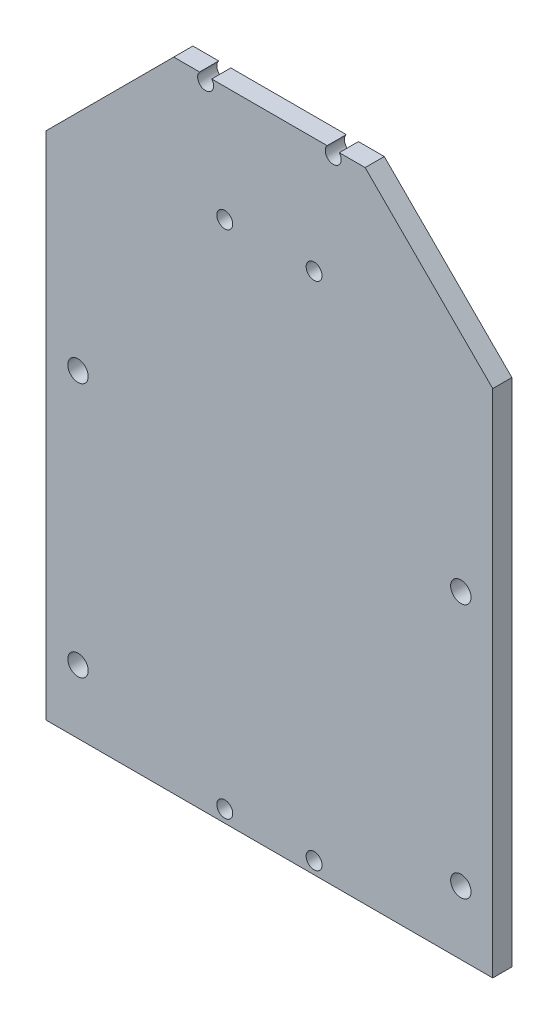
ISO-10303-21;
HEADER;
FILE_DESCRIPTION(('STEP AP214'),'2;1');
FILE_NAME('part.step','',(''),(''),'','','');
FILE_SCHEMA(('AUTOMOTIVE_DESIGN { 1 0 10303 214 1 1 1 1 }'));
ENDSEC;
DATA;
#1=APPLICATION_CONTEXT('core data for automotive mechanical design processes');
#2=APPLICATION_PROTOCOL_DEFINITION('international standard','automotive_design',2000,#1);
#3=PRODUCT_CONTEXT('',#1,'mechanical');
#4=PRODUCT('Part','Part','',(#3));
#5=PRODUCT_RELATED_PRODUCT_CATEGORY('part','',(#4));
#6=PRODUCT_DEFINITION_FORMATION('','',#4);
#7=PRODUCT_DEFINITION_CONTEXT('part definition',#1,'design');
#8=PRODUCT_DEFINITION('design','',#6,#7);
#9=PRODUCT_DEFINITION_SHAPE('','',#8);
#10=(LENGTH_UNIT() NAMED_UNIT(*) SI_UNIT(.MILLI.,.METRE.));
#11=(NAMED_UNIT(*) PLANE_ANGLE_UNIT() SI_UNIT($,.RADIAN.));
#12=(NAMED_UNIT(*) SI_UNIT($,.STERADIAN.) SOLID_ANGLE_UNIT());
#13=UNCERTAINTY_MEASURE_WITH_UNIT(LENGTH_MEASURE(1.E-05),#10,'distance_accuracy_value','');
#14=(GEOMETRIC_REPRESENTATION_CONTEXT(3) GLOBAL_UNCERTAINTY_ASSIGNED_CONTEXT((#13)) GLOBAL_UNIT_ASSIGNED_CONTEXT((#10,
#11,#12)) REPRESENTATION_CONTEXT('',''));
#15=CARTESIAN_POINT('',(0.,0.,0.));
#16=DIRECTION('',(0.,0.,1.));
#17=DIRECTION('',(1.,0.,0.));
#18=AXIS2_PLACEMENT_3D('',#15,#16,#17);
#19=CARTESIAN_POINT('',(-79.2332323241201,122.350653578044,3.));
#20=DIRECTION('',(0.,-1.,0.));
#21=DIRECTION('',(0.,0.,-1.));
#22=AXIS2_PLACEMENT_3D('',#19,#20,#21);
#23=PLANE('',#22);
#24=DIRECTION('',(-1.,0.,0.));
#25=VECTOR('',#24,1.);
#26=CARTESIAN_POINT('',(-79.2332323241201,122.350653578044,0.));
#27=LINE('',#26,#25);
#28=CARTESIAN_POINT('',(-55.1815029847395,122.350653578044,0.));
#29=VERTEX_POINT('',#28);
#30=CARTESIAN_POINT('',(-59.23323232412,122.350653578044,0.));
#31=VERTEX_POINT('',#30);
#32=EDGE_CURVE('E151',#29,#31,#27,.T.);
#33=ORIENTED_EDGE('',*,*,#32,.T.);
#34=DIRECTION('',(0.,0.,1.));
#35=VECTOR('',#34,1.);
#36=CARTESIAN_POINT('',(-59.23323232412,122.350653578044,3.));
#37=LINE('',#36,#35);
#38=CARTESIAN_POINT('',(-59.23323232412,122.350653578044,3.));
#39=VERTEX_POINT('',#38);
#40=EDGE_CURVE('E171',#31,#39,#37,.T.);
#41=ORIENTED_EDGE('',*,*,#40,.T.);
#42=DIRECTION('',(-1.,0.,0.));
#43=VECTOR('',#42,1.);
#44=CARTESIAN_POINT('',(-79.2332323241201,122.350653578044,3.));
#45=LINE('',#44,#43);
#46=CARTESIAN_POINT('',(-55.1815029847395,122.350653578044,3.));
#47=VERTEX_POINT('',#46);
#48=EDGE_CURVE('E137',#47,#39,#45,.T.);
#49=ORIENTED_EDGE('',*,*,#48,.F.);
#50=DIRECTION('',(0.,0.,-1.));
#51=VECTOR('',#50,1.);
#52=CARTESIAN_POINT('',(-55.1815029847395,122.350653578044,3.));
#53=LINE('',#52,#51);
#54=EDGE_CURVE('E193',#47,#29,#53,.T.);
#55=ORIENTED_EDGE('',*,*,#54,.T.);
#56=EDGE_LOOP('',(#33,#41,#49,#55));
#57=FACE_BOUND('',#56,.T.);
#58=ADVANCED_FACE('F34',(#57),#23,.F.);
#59=CARTESIAN_POINT('',(-35.1815029847394,122.350653578044,0.));
#60=VERTEX_POINT('',#59);
#61=CARTESIAN_POINT('',(-53.2849616634968,122.350653578044,0.));
#62=VERTEX_POINT('',#61);
#63=EDGE_CURVE('E155',#60,#62,#27,.T.);
#64=ORIENTED_EDGE('',*,*,#63,.T.);
#65=DIRECTION('',(0.,0.,-1.));
#66=VECTOR('',#65,1.);
#67=CARTESIAN_POINT('',(-53.2849616634968,122.350653578044,3.));
#68=LINE('',#67,#66);
#69=CARTESIAN_POINT('',(-53.2849616634968,122.350653578044,3.));
#70=VERTEX_POINT('',#69);
#71=EDGE_CURVE('E123',#62,#70,#68,.F.);
#72=ORIENTED_EDGE('',*,*,#71,.T.);
#73=CARTESIAN_POINT('',(-35.1815029847394,122.350653578044,3.));
#74=VERTEX_POINT('',#73);
#75=EDGE_CURVE('E130',#74,#70,#45,.T.);
#76=ORIENTED_EDGE('',*,*,#75,.F.);
#77=DIRECTION('',(0.,0.,-1.));
#78=VECTOR('',#77,1.);
#79=CARTESIAN_POINT('',(-35.1815029847394,122.350653578044,3.));
#80=LINE('',#79,#78);
#81=EDGE_CURVE('E111',#74,#60,#80,.T.);
#82=ORIENTED_EDGE('',*,*,#81,.T.);
#83=EDGE_LOOP('',(#64,#72,#76,#82));
#84=FACE_BOUND('',#83,.T.);
#85=ADVANCED_FACE('F136',(#84),#23,.F.);
#86=CARTESIAN_POINT('',(-79.2332323241201,22.3506535780441,3.));
#87=DIRECTION('',(1.,0.,0.));
#88=DIRECTION('',(0.,0.,-1.));
#89=AXIS2_PLACEMENT_3D('',#86,#87,#88);
#90=PLANE('',#89);
#91=DIRECTION('',(0.,-1.,0.));
#92=VECTOR('',#91,1.);
#93=CARTESIAN_POINT('',(-79.2332323241201,22.3506535780441,3.));
#94=LINE('',#93,#92);
#95=CARTESIAN_POINT('',(-79.2332323241201,102.350653578044,3.));
#96=VERTEX_POINT('',#95);
#97=CARTESIAN_POINT('',(-79.2332323241201,22.3506535780441,3.));
#98=VERTEX_POINT('',#97);
#99=EDGE_CURVE('E154',#96,#98,#94,.T.);
#100=ORIENTED_EDGE('',*,*,#99,.F.);
#101=DIRECTION('',(0.,0.,-1.));
#102=VECTOR('',#101,1.);
#103=CARTESIAN_POINT('',(-79.2332323241201,102.350653578044,3.));
#104=LINE('',#103,#102);
#105=CARTESIAN_POINT('',(-79.2332323241201,102.350653578044,0.));
#106=VERTEX_POINT('',#105);
#107=EDGE_CURVE('E164',#96,#106,#104,.T.);
#108=ORIENTED_EDGE('',*,*,#107,.T.);
#109=DIRECTION('',(0.,-1.,0.));
#110=VECTOR('',#109,1.);
#111=CARTESIAN_POINT('',(-79.2332323241201,22.3506535780441,0.));
#112=LINE('',#111,#110);
#113=CARTESIAN_POINT('',(-79.2332323241201,22.3506535780441,0.));
#114=VERTEX_POINT('',#113);
#115=EDGE_CURVE('E144',#106,#114,#112,.T.);
#116=ORIENTED_EDGE('',*,*,#115,.T.);
#117=DIRECTION('',(0.,0.,-1.));
#118=VECTOR('',#117,1.);
#119=CARTESIAN_POINT('',(-79.2332323241201,22.3506535780441,3.));
#120=LINE('',#119,#118);
#121=EDGE_CURVE('E158',#98,#114,#120,.T.);
#122=ORIENTED_EDGE('',*,*,#121,.F.);
#123=EDGE_LOOP('',(#100,#108,#116,#122));
#124=FACE_BOUND('',#123,.T.);
#125=ADVANCED_FACE('F202',(#124),#90,.F.);
#126=CARTESIAN_POINT('',(-79.2332323241201,22.3506535780441,3.));
#127=DIRECTION('',(0.,1.,0.));
#128=DIRECTION('',(0.,0.,1.));
#129=AXIS2_PLACEMENT_3D('',#126,#127,#128);
#130=PLANE('',#129);
#131=DIRECTION('',(1.,0.,0.));
#132=VECTOR('',#131,1.);
#133=CARTESIAN_POINT('',(-79.2332323241201,22.3506535780441,0.));
#134=LINE('',#133,#132);
#135=CARTESIAN_POINT('',(-9.23323232412008,22.3506535780441,0.));
#136=VERTEX_POINT('',#135);
#137=EDGE_CURVE('E146',#114,#136,#134,.T.);
#138=ORIENTED_EDGE('',*,*,#137,.T.);
#139=DIRECTION('',(0.,0.,-1.));
#140=VECTOR('',#139,1.);
#141=CARTESIAN_POINT('',(-9.23323232412008,22.3506535780441,3.));
#142=LINE('',#141,#140);
#143=CARTESIAN_POINT('',(-9.23323232412008,22.3506535780441,3.));
#144=VERTEX_POINT('',#143);
#145=EDGE_CURVE('E139',#144,#136,#142,.T.);
#146=ORIENTED_EDGE('',*,*,#145,.F.);
#147=DIRECTION('',(1.,0.,0.));
#148=VECTOR('',#147,1.);
#149=CARTESIAN_POINT('',(-79.2332323241201,22.3506535780441,3.));
#150=LINE('',#149,#148);
#151=EDGE_CURVE('E203',#98,#144,#150,.T.);
#152=ORIENTED_EDGE('',*,*,#151,.F.);
#153=ORIENTED_EDGE('',*,*,#121,.T.);
#154=EDGE_LOOP('',(#138,#146,#152,#153));
#155=FACE_BOUND('',#154,.T.);
#156=ADVANCED_FACE('F302',(#155),#130,.F.);
#157=CARTESIAN_POINT('',(-9.23323232412008,22.3506535780441,3.));
#158=DIRECTION('',(-1.,0.,0.));
#159=DIRECTION('',(0.,-1.,0.));
#160=AXIS2_PLACEMENT_3D('',#157,#158,#159);
#161=PLANE('',#160);
#162=DIRECTION('',(0.,1.,0.));
#163=VECTOR('',#162,1.);
#164=CARTESIAN_POINT('',(-9.23323232412008,22.3506535780441,0.));
#165=LINE('',#164,#163);
#166=CARTESIAN_POINT('',(-9.23323232412008,102.350653578044,0.));
#167=VERTEX_POINT('',#166);
#168=EDGE_CURVE('E149',#136,#167,#165,.T.);
#169=ORIENTED_EDGE('',*,*,#168,.T.);
#170=DIRECTION('',(0.,0.,1.));
#171=VECTOR('',#170,1.);
#172=CARTESIAN_POINT('',(-9.23323232412008,102.350653578044,3.));
#173=LINE('',#172,#171);
#174=CARTESIAN_POINT('',(-9.23323232412008,102.350653578044,3.));
#175=VERTEX_POINT('',#174);
#176=EDGE_CURVE('E11',#167,#175,#173,.T.);
#177=ORIENTED_EDGE('',*,*,#176,.T.);
#178=DIRECTION('',(0.,1.,0.));
#179=VECTOR('',#178,1.);
#180=CARTESIAN_POINT('',(-9.23323232412008,22.3506535780441,3.));
#181=LINE('',#180,#179);
#182=EDGE_CURVE('E140',#144,#175,#181,.T.);
#183=ORIENTED_EDGE('',*,*,#182,.F.);
#184=ORIENTED_EDGE('',*,*,#145,.T.);
#185=EDGE_LOOP('',(#169,#177,#183,#184));
#186=FACE_BOUND('',#185,.T.);
#187=ADVANCED_FACE('F292',(#186),#161,.F.);
#188=CARTESIAN_POINT('',(-29.2332323241201,122.350653578044,3.));
#189=VERTEX_POINT('',#188);
#190=CARTESIAN_POINT('',(-33.2849616634968,122.350653578044,3.));
#191=VERTEX_POINT('',#190);
#192=EDGE_CURVE('E131',#189,#191,#45,.T.);
#193=ORIENTED_EDGE('',*,*,#192,.F.);
#194=DIRECTION('',(0.,0.,-1.));
#195=VECTOR('',#194,1.);
#196=CARTESIAN_POINT('',(-29.2332323241201,122.350653578044,3.));
#197=LINE('',#196,#195);
#198=CARTESIAN_POINT('',(-29.2332323241201,122.350653578044,0.));
#199=VERTEX_POINT('',#198);
#200=EDGE_CURVE('E42',#189,#199,#197,.T.);
#201=ORIENTED_EDGE('',*,*,#200,.T.);
#202=CARTESIAN_POINT('',(-33.2849616634968,122.350653578044,0.));
#203=VERTEX_POINT('',#202);
#204=EDGE_CURVE('E152',#199,#203,#27,.T.);
#205=ORIENTED_EDGE('',*,*,#204,.T.);
#206=DIRECTION('',(0.,0.,-1.));
#207=VECTOR('',#206,1.);
#208=CARTESIAN_POINT('',(-33.2849616634968,122.350653578044,3.));
#209=LINE('',#208,#207);
#210=EDGE_CURVE('E124',#203,#191,#209,.F.);
#211=ORIENTED_EDGE('',*,*,#210,.T.);
#212=EDGE_LOOP('',(#193,#201,#205,#211));
#213=FACE_BOUND('',#212,.T.);
#214=ADVANCED_FACE('F179',(#213),#23,.F.);
#215=CARTESIAN_POINT('',(0.,0.,3.));
#216=DIRECTION('',(0.,0.,-1.));
#217=DIRECTION('',(-1.,0.,0.));
#218=AXIS2_PLACEMENT_3D('',#215,#216,#217);
#219=PLANE('',#218);
#220=CARTESIAN_POINT('',(-51.2330663241181,104.2862198488,3.));
#221=DIRECTION('',(0.,0.,-1.));
#222=DIRECTION('',(-1.,0.,0.));
#223=AXIS2_PLACEMENT_3D('',#220,#221,#222);
#224=CIRCLE('',#223,1.25);
#225=CARTESIAN_POINT('',(-52.4830663241181,104.2862198488,3.));
#226=VERTEX_POINT('',#225);
#227=EDGE_CURVE('E236',#226,#226,#224,.T.);
#228=ORIENTED_EDGE('',*,*,#227,.T.);
#229=EDGE_LOOP('',(#228));
#230=FACE_BOUND('',#229,.T.);
#231=CARTESIAN_POINT('',(-37.2330663241181,24.2862198488002,3.));
#232=DIRECTION('',(0.,0.,-1.));
#233=DIRECTION('',(-1.,0.,0.));
#234=AXIS2_PLACEMENT_3D('',#231,#232,#233);
#235=CIRCLE('',#234,1.25);
#236=CARTESIAN_POINT('',(-38.4830663241181,24.2862198488002,3.));
#237=VERTEX_POINT('',#236);
#238=EDGE_CURVE('E243',#237,#237,#235,.T.);
#239=ORIENTED_EDGE('',*,*,#238,.T.);
#240=EDGE_LOOP('',(#239));
#241=FACE_BOUND('',#240,.T.);
#242=CARTESIAN_POINT('',(-51.2330663241181,24.2862198488002,3.));
#243=DIRECTION('',(0.,0.,-1.));
#244=DIRECTION('',(-1.,0.,0.));
#245=AXIS2_PLACEMENT_3D('',#242,#243,#244);
#246=CIRCLE('',#245,1.25);
#247=CARTESIAN_POINT('',(-52.4830663241181,24.2862198488002,3.));
#248=VERTEX_POINT('',#247);
#249=EDGE_CURVE('E244',#248,#248,#246,.T.);
#250=ORIENTED_EDGE('',*,*,#249,.T.);
#251=EDGE_LOOP('',(#250));
#252=FACE_BOUND('',#251,.T.);
#253=CARTESIAN_POINT('',(-37.2330663241181,104.2862198488,3.));
#254=DIRECTION('',(0.,0.,-1.));
#255=DIRECTION('',(-1.,0.,0.));
#256=AXIS2_PLACEMENT_3D('',#253,#254,#255);
#257=CIRCLE('',#256,1.25);
#258=CARTESIAN_POINT('',(-38.4830663241181,104.2862198488,3.));
#259=VERTEX_POINT('',#258);
#260=EDGE_CURVE('E232',#259,#259,#257,.T.);
#261=ORIENTED_EDGE('',*,*,#260,.T.);
#262=EDGE_LOOP('',(#261));
#263=FACE_BOUND('',#262,.T.);
#264=CARTESIAN_POINT('',(-74.2332323241201,72.2862198488002,3.));
#265=DIRECTION('',(0.,0.,1.));
#266=DIRECTION('',(1.,0.,0.));
#267=AXIS2_PLACEMENT_3D('',#264,#265,#266);
#268=CIRCLE('',#267,1.60000000000001);
#269=CARTESIAN_POINT('',(-72.6332323241201,72.2862198488002,3.));
#270=VERTEX_POINT('',#269);
#271=EDGE_CURVE('E212',#270,#270,#268,.T.);
#272=ORIENTED_EDGE('',*,*,#271,.F.);
#273=EDGE_LOOP('',(#272));
#274=FACE_BOUND('',#273,.T.);
#275=CARTESIAN_POINT('',(-14.2332323241201,72.2862198488002,3.));
#276=DIRECTION('',(0.,0.,1.));
#277=DIRECTION('',(1.,0.,0.));
#278=AXIS2_PLACEMENT_3D('',#275,#276,#277);
#279=CIRCLE('',#278,1.60000000000001);
#280=CARTESIAN_POINT('',(-12.6332323241201,72.2862198488002,3.));
#281=VERTEX_POINT('',#280);
#282=EDGE_CURVE('E218',#281,#281,#279,.T.);
#283=ORIENTED_EDGE('',*,*,#282,.F.);
#284=EDGE_LOOP('',(#283));
#285=FACE_BOUND('',#284,.T.);
#286=CARTESIAN_POINT('',(-14.2332323241201,32.3506535780441,3.));
#287=DIRECTION('',(0.,0.,1.));
#288=DIRECTION('',(1.,0.,0.));
#289=AXIS2_PLACEMENT_3D('',#286,#287,#288);
#290=CIRCLE('',#289,1.6);
#291=CARTESIAN_POINT('',(-12.6332323241201,32.3506535780441,3.));
#292=VERTEX_POINT('',#291);
#293=EDGE_CURVE('E224',#292,#292,#290,.T.);
#294=ORIENTED_EDGE('',*,*,#293,.F.);
#295=EDGE_LOOP('',(#294));
#296=FACE_BOUND('',#295,.T.);
#297=CARTESIAN_POINT('',(-74.2332323241201,32.3506535780441,3.));
#298=DIRECTION('',(0.,0.,1.));
#299=DIRECTION('',(1.,0.,0.));
#300=AXIS2_PLACEMENT_3D('',#297,#298,#299);
#301=CIRCLE('',#300,1.6);
#302=CARTESIAN_POINT('',(-72.6332323241201,32.3506535780441,3.));
#303=VERTEX_POINT('',#302);
#304=EDGE_CURVE('E206',#303,#303,#301,.T.);
#305=ORIENTED_EDGE('',*,*,#304,.F.);
#306=EDGE_LOOP('',(#305));
#307=FACE_BOUND('',#306,.T.);
#308=ORIENTED_EDGE('',*,*,#48,.T.);
#309=DIRECTION('',(0.707106781186549,0.707106781186546,0.));
#310=VECTOR('',#309,1.);
#311=CARTESIAN_POINT('',(-79.2332323241201,102.350653578044,3.));
#312=LINE('',#311,#310);
#313=EDGE_CURVE('E174',#39,#96,#312,.F.);
#314=ORIENTED_EDGE('',*,*,#313,.T.);
#315=ORIENTED_EDGE('',*,*,#99,.T.);
#316=ORIENTED_EDGE('',*,*,#151,.T.);
#317=ORIENTED_EDGE('',*,*,#182,.T.);
#318=DIRECTION('',(0.707106781186546,-0.707106781186549,0.));
#319=VECTOR('',#318,1.);
#320=CARTESIAN_POINT('',(-29.2332323241201,122.350653578044,3.));
#321=LINE('',#320,#319);
#322=EDGE_CURVE('E49',#175,#189,#321,.F.);
#323=ORIENTED_EDGE('',*,*,#322,.T.);
#324=ORIENTED_EDGE('',*,*,#192,.T.);
#325=CARTESIAN_POINT('',(-34.2332323241181,121.5362318481,3.));
#326=DIRECTION('',(0.,0.,-1.));
#327=DIRECTION('',(-1.,0.,0.));
#328=AXIS2_PLACEMENT_3D('',#325,#326,#327);
#329=CIRCLE('',#328,1.25);
#330=EDGE_CURVE('E115',#191,#74,#329,.T.);
#331=ORIENTED_EDGE('',*,*,#330,.T.);
#332=ORIENTED_EDGE('',*,*,#75,.T.);
#333=CARTESIAN_POINT('',(-54.2332323241181,121.5362318481,3.));
#334=DIRECTION('',(0.,0.,-1.));
#335=DIRECTION('',(-1.,0.,0.));
#336=AXIS2_PLACEMENT_3D('',#333,#334,#335);
#337=CIRCLE('',#336,1.25);
#338=EDGE_CURVE('E133',#70,#47,#337,.T.);
#339=ORIENTED_EDGE('',*,*,#338,.T.);
#340=EDGE_LOOP('',(#308,#314,#315,#316,#317,#323,#324,#331,#332,#339));
#341=FACE_BOUND('',#340,.T.);
#342=ADVANCED_FACE('F128',(#230,#241,#252,#263,#274,#285,#296,#307,#341),#219,.F.);
#343=CARTESIAN_POINT('',(0.,0.,0.));
#344=DIRECTION('',(0.,0.,-1.));
#345=DIRECTION('',(-1.,0.,0.));
#346=AXIS2_PLACEMENT_3D('',#343,#344,#345);
#347=PLANE('',#346);
#348=ORIENTED_EDGE('',*,*,#115,.F.);
#349=DIRECTION('',(-0.707106781186549,-0.707106781186546,0.));
#350=VECTOR('',#349,1.);
#351=CARTESIAN_POINT('',(-90.791942951082,90.7919429510823,0.));
#352=LINE('',#351,#350);
#353=EDGE_CURVE('E169',#106,#31,#352,.F.);
#354=ORIENTED_EDGE('',*,*,#353,.T.);
#355=ORIENTED_EDGE('',*,*,#32,.F.);
#356=CARTESIAN_POINT('',(-54.2332323241181,121.5362318481,0.));
#357=DIRECTION('',(0.,0.,-1.));
#358=DIRECTION('',(-1.,0.,0.));
#359=AXIS2_PLACEMENT_3D('',#356,#357,#358);
#360=CIRCLE('',#359,1.25);
#361=EDGE_CURVE('E162',#62,#29,#360,.T.);
#362=ORIENTED_EDGE('',*,*,#361,.F.);
#363=ORIENTED_EDGE('',*,*,#63,.F.);
#364=CARTESIAN_POINT('',(-34.2332323241181,121.5362318481,0.));
#365=DIRECTION('',(0.,0.,-1.));
#366=DIRECTION('',(-1.,0.,0.));
#367=AXIS2_PLACEMENT_3D('',#364,#365,#366);
#368=CIRCLE('',#367,1.25);
#369=EDGE_CURVE('E118',#203,#60,#368,.T.);
#370=ORIENTED_EDGE('',*,*,#369,.F.);
#371=ORIENTED_EDGE('',*,*,#204,.F.);
#372=DIRECTION('',(-0.707106781186546,0.707106781186549,0.));
#373=VECTOR('',#372,1.);
#374=CARTESIAN_POINT('',(46.558710626962,46.5587106269618,0.));
#375=LINE('',#374,#373);
#376=EDGE_CURVE('E167',#199,#167,#375,.F.);
#377=ORIENTED_EDGE('',*,*,#376,.T.);
#378=ORIENTED_EDGE('',*,*,#168,.F.);
#379=ORIENTED_EDGE('',*,*,#137,.F.);
#380=EDGE_LOOP('',(#348,#354,#355,#362,#363,#370,#371,#377,#378,#379));
#381=FACE_BOUND('',#380,.T.);
#382=CARTESIAN_POINT('',(-51.2330663241181,104.2862198488,0.));
#383=DIRECTION('',(0.,0.,-1.));
#384=DIRECTION('',(-1.,0.,0.));
#385=AXIS2_PLACEMENT_3D('',#382,#383,#384);
#386=CIRCLE('',#385,1.25);
#387=CARTESIAN_POINT('',(-52.4830663241181,104.2862198488,0.));
#388=VERTEX_POINT('',#387);
#389=EDGE_CURVE('E247',#388,#388,#386,.T.);
#390=ORIENTED_EDGE('',*,*,#389,.F.);
#391=EDGE_LOOP('',(#390));
#392=FACE_BOUND('',#391,.T.);
#393=CARTESIAN_POINT('',(-37.2330663241181,24.2862198488002,0.));
#394=DIRECTION('',(0.,0.,-1.));
#395=DIRECTION('',(-1.,0.,0.));
#396=AXIS2_PLACEMENT_3D('',#393,#394,#395);
#397=CIRCLE('',#396,1.25);
#398=CARTESIAN_POINT('',(-38.4830663241181,24.2862198488002,0.));
#399=VERTEX_POINT('',#398);
#400=EDGE_CURVE('E240',#399,#399,#397,.T.);
#401=ORIENTED_EDGE('',*,*,#400,.F.);
#402=EDGE_LOOP('',(#401));
#403=FACE_BOUND('',#402,.T.);
#404=CARTESIAN_POINT('',(-51.2330663241181,24.2862198488002,0.));
#405=DIRECTION('',(0.,0.,-1.));
#406=DIRECTION('',(-1.,0.,0.));
#407=AXIS2_PLACEMENT_3D('',#404,#405,#406);
#408=CIRCLE('',#407,1.25);
#409=CARTESIAN_POINT('',(-52.4830663241181,24.2862198488002,0.));
#410=VERTEX_POINT('',#409);
#411=EDGE_CURVE('E132',#410,#410,#408,.T.);
#412=ORIENTED_EDGE('',*,*,#411,.F.);
#413=EDGE_LOOP('',(#412));
#414=FACE_BOUND('',#413,.T.);
#415=CARTESIAN_POINT('',(-37.2330663241181,104.2862198488,0.));
#416=DIRECTION('',(0.,0.,-1.));
#417=DIRECTION('',(-1.,0.,0.));
#418=AXIS2_PLACEMENT_3D('',#415,#416,#417);
#419=CIRCLE('',#418,1.25);
#420=CARTESIAN_POINT('',(-38.4830663241181,104.2862198488,0.));
#421=VERTEX_POINT('',#420);
#422=EDGE_CURVE('E233',#421,#421,#419,.T.);
#423=ORIENTED_EDGE('',*,*,#422,.F.);
#424=EDGE_LOOP('',(#423));
#425=FACE_BOUND('',#424,.T.);
#426=CARTESIAN_POINT('',(-74.2332323241201,72.2862198488002,0.));
#427=DIRECTION('',(0.,0.,1.));
#428=DIRECTION('',(1.,0.,0.));
#429=AXIS2_PLACEMENT_3D('',#426,#427,#428);
#430=CIRCLE('',#429,1.60000000000001);
#431=CARTESIAN_POINT('',(-72.6332323241201,72.2862198488002,0.));
#432=VERTEX_POINT('',#431);
#433=EDGE_CURVE('E215',#432,#432,#430,.T.);
#434=ORIENTED_EDGE('',*,*,#433,.T.);
#435=EDGE_LOOP('',(#434));
#436=FACE_BOUND('',#435,.T.);
#437=CARTESIAN_POINT('',(-14.2332323241201,72.2862198488002,0.));
#438=DIRECTION('',(0.,0.,1.));
#439=DIRECTION('',(1.,0.,0.));
#440=AXIS2_PLACEMENT_3D('',#437,#438,#439);
#441=CIRCLE('',#440,1.60000000000001);
#442=CARTESIAN_POINT('',(-12.6332323241201,72.2862198488002,0.));
#443=VERTEX_POINT('',#442);
#444=EDGE_CURVE('E221',#443,#443,#441,.T.);
#445=ORIENTED_EDGE('',*,*,#444,.T.);
#446=EDGE_LOOP('',(#445));
#447=FACE_BOUND('',#446,.T.);
#448=CARTESIAN_POINT('',(-14.2332323241201,32.3506535780441,0.));
#449=DIRECTION('',(0.,0.,1.));
#450=DIRECTION('',(1.,0.,0.));
#451=AXIS2_PLACEMENT_3D('',#448,#449,#450);
#452=CIRCLE('',#451,1.6);
#453=CARTESIAN_POINT('',(-12.6332323241201,32.3506535780441,0.));
#454=VERTEX_POINT('',#453);
#455=EDGE_CURVE('E209',#454,#454,#452,.T.);
#456=ORIENTED_EDGE('',*,*,#455,.T.);
#457=EDGE_LOOP('',(#456));
#458=FACE_BOUND('',#457,.T.);
#459=CARTESIAN_POINT('',(-74.2332323241201,32.3506535780441,0.));
#460=DIRECTION('',(0.,0.,1.));
#461=DIRECTION('',(1.,0.,0.));
#462=AXIS2_PLACEMENT_3D('',#459,#460,#461);
#463=CIRCLE('',#462,1.6);
#464=CARTESIAN_POINT('',(-72.6332323241201,32.3506535780441,0.));
#465=VERTEX_POINT('',#464);
#466=EDGE_CURVE('E147',#465,#465,#463,.T.);
#467=ORIENTED_EDGE('',*,*,#466,.T.);
#468=EDGE_LOOP('',(#467));
#469=FACE_BOUND('',#468,.T.);
#470=ADVANCED_FACE('F183',(#381,#392,#403,#414,#425,#436,#447,#458,#469),#347,.T.);
#471=CARTESIAN_POINT('',(-74.2332323241201,32.3506535780441,0.));
#472=DIRECTION('',(0.,0.,1.));
#473=DIRECTION('',(1.,0.,0.));
#474=AXIS2_PLACEMENT_3D('',#471,#472,#473);
#475=CYLINDRICAL_SURFACE('',#474,1.6);
#476=ORIENTED_EDGE('',*,*,#466,.F.);
#477=EDGE_LOOP('',(#476));
#478=FACE_BOUND('',#477,.T.);
#479=ORIENTED_EDGE('',*,*,#304,.T.);
#480=EDGE_LOOP('',(#479));
#481=FACE_BOUND('',#480,.T.);
#482=ADVANCED_FACE('F268',(#478,#481),#475,.F.);
#483=CARTESIAN_POINT('',(-14.2332323241201,32.3506535780441,0.));
#484=DIRECTION('',(0.,0.,1.));
#485=DIRECTION('',(1.,0.,0.));
#486=AXIS2_PLACEMENT_3D('',#483,#484,#485);
#487=CYLINDRICAL_SURFACE('',#486,1.6);
#488=ORIENTED_EDGE('',*,*,#455,.F.);
#489=EDGE_LOOP('',(#488));
#490=FACE_BOUND('',#489,.T.);
#491=ORIENTED_EDGE('',*,*,#293,.T.);
#492=EDGE_LOOP('',(#491));
#493=FACE_BOUND('',#492,.T.);
#494=ADVANCED_FACE('F282',(#490,#493),#487,.F.);
#495=CARTESIAN_POINT('',(-14.2332323241201,72.2862198488002,0.));
#496=DIRECTION('',(0.,0.,1.));
#497=DIRECTION('',(1.,0.,0.));
#498=AXIS2_PLACEMENT_3D('',#495,#496,#497);
#499=CYLINDRICAL_SURFACE('',#498,1.60000000000001);
#500=ORIENTED_EDGE('',*,*,#444,.F.);
#501=EDGE_LOOP('',(#500));
#502=FACE_BOUND('',#501,.T.);
#503=ORIENTED_EDGE('',*,*,#282,.T.);
#504=EDGE_LOOP('',(#503));
#505=FACE_BOUND('',#504,.T.);
#506=ADVANCED_FACE('F330',(#502,#505),#499,.F.);
#507=CARTESIAN_POINT('',(-74.2332323241201,72.2862198488002,0.));
#508=DIRECTION('',(0.,0.,1.));
#509=DIRECTION('',(1.,0.,0.));
#510=AXIS2_PLACEMENT_3D('',#507,#508,#509);
#511=CYLINDRICAL_SURFACE('',#510,1.60000000000001);
#512=ORIENTED_EDGE('',*,*,#433,.F.);
#513=EDGE_LOOP('',(#512));
#514=FACE_BOUND('',#513,.T.);
#515=ORIENTED_EDGE('',*,*,#271,.T.);
#516=EDGE_LOOP('',(#515));
#517=FACE_BOUND('',#516,.T.);
#518=ADVANCED_FACE('F326',(#514,#517),#511,.F.);
#519=CARTESIAN_POINT('',(-37.2330663241181,104.2862198488,3.));
#520=DIRECTION('',(0.,0.,-1.));
#521=DIRECTION('',(-1.,0.,0.));
#522=AXIS2_PLACEMENT_3D('',#519,#520,#521);
#523=CYLINDRICAL_SURFACE('',#522,1.25);
#524=ORIENTED_EDGE('',*,*,#260,.F.);
#525=EDGE_LOOP('',(#524));
#526=FACE_BOUND('',#525,.T.);
#527=ORIENTED_EDGE('',*,*,#422,.T.);
#528=EDGE_LOOP('',(#527));
#529=FACE_BOUND('',#528,.T.);
#530=ADVANCED_FACE('F323',(#526,#529),#523,.F.);
#531=CARTESIAN_POINT('',(-34.2332323241181,121.5362318481,3.));
#532=DIRECTION('',(0.,0.,-1.));
#533=DIRECTION('',(-1.,0.,0.));
#534=AXIS2_PLACEMENT_3D('',#531,#532,#533);
#535=CYLINDRICAL_SURFACE('',#534,1.25);
#536=ORIENTED_EDGE('',*,*,#330,.F.);
#537=ORIENTED_EDGE('',*,*,#210,.F.);
#538=ORIENTED_EDGE('',*,*,#369,.T.);
#539=ORIENTED_EDGE('',*,*,#81,.F.);
#540=EDGE_LOOP('',(#536,#537,#538,#539));
#541=FACE_BOUND('',#540,.T.);
#542=ADVANCED_FACE('F113',(#541),#535,.F.);
#543=CARTESIAN_POINT('',(-51.2330663241181,24.2862198488002,3.));
#544=DIRECTION('',(0.,0.,-1.));
#545=DIRECTION('',(-1.,0.,0.));
#546=AXIS2_PLACEMENT_3D('',#543,#544,#545);
#547=CYLINDRICAL_SURFACE('',#546,1.25);
#548=ORIENTED_EDGE('',*,*,#249,.F.);
#549=EDGE_LOOP('',(#548));
#550=FACE_BOUND('',#549,.T.);
#551=ORIENTED_EDGE('',*,*,#411,.T.);
#552=EDGE_LOOP('',(#551));
#553=FACE_BOUND('',#552,.T.);
#554=ADVANCED_FACE('F259',(#550,#553),#547,.F.);
#555=CARTESIAN_POINT('',(-37.2330663241181,24.2862198488002,3.));
#556=DIRECTION('',(0.,0.,-1.));
#557=DIRECTION('',(-1.,0.,0.));
#558=AXIS2_PLACEMENT_3D('',#555,#556,#557);
#559=CYLINDRICAL_SURFACE('',#558,1.25);
#560=ORIENTED_EDGE('',*,*,#238,.F.);
#561=EDGE_LOOP('',(#560));
#562=FACE_BOUND('',#561,.T.);
#563=ORIENTED_EDGE('',*,*,#400,.T.);
#564=EDGE_LOOP('',(#563));
#565=FACE_BOUND('',#564,.T.);
#566=ADVANCED_FACE('F262',(#562,#565),#559,.F.);
#567=CARTESIAN_POINT('',(-51.2330663241181,104.2862198488,3.));
#568=DIRECTION('',(0.,0.,-1.));
#569=DIRECTION('',(-1.,0.,0.));
#570=AXIS2_PLACEMENT_3D('',#567,#568,#569);
#571=CYLINDRICAL_SURFACE('',#570,1.25);
#572=ORIENTED_EDGE('',*,*,#227,.F.);
#573=EDGE_LOOP('',(#572));
#574=FACE_BOUND('',#573,.T.);
#575=ORIENTED_EDGE('',*,*,#389,.T.);
#576=EDGE_LOOP('',(#575));
#577=FACE_BOUND('',#576,.T.);
#578=ADVANCED_FACE('F313',(#574,#577),#571,.F.);
#579=CARTESIAN_POINT('',(-54.2332323241181,121.5362318481,3.));
#580=DIRECTION('',(0.,0.,-1.));
#581=DIRECTION('',(-1.,0.,0.));
#582=AXIS2_PLACEMENT_3D('',#579,#580,#581);
#583=CYLINDRICAL_SURFACE('',#582,1.25);
#584=ORIENTED_EDGE('',*,*,#338,.F.);
#585=ORIENTED_EDGE('',*,*,#71,.F.);
#586=ORIENTED_EDGE('',*,*,#361,.T.);
#587=ORIENTED_EDGE('',*,*,#54,.F.);
#588=EDGE_LOOP('',(#584,#585,#586,#587));
#589=FACE_BOUND('',#588,.T.);
#590=ADVANCED_FACE('F308',(#589),#583,.F.);
#591=CARTESIAN_POINT('',(-79.2332323241201,102.350653578044,3.));
#592=DIRECTION('',(0.707106781186546,-0.707106781186549,0.));
#593=DIRECTION('',(0.,0.,-1.));
#594=AXIS2_PLACEMENT_3D('',#591,#592,#593);
#595=PLANE('',#594);
#596=ORIENTED_EDGE('',*,*,#313,.F.);
#597=ORIENTED_EDGE('',*,*,#40,.F.);
#598=ORIENTED_EDGE('',*,*,#353,.F.);
#599=ORIENTED_EDGE('',*,*,#107,.F.);
#600=EDGE_LOOP('',(#596,#597,#598,#599));
#601=FACE_BOUND('',#600,.T.);
#602=ADVANCED_FACE('F196',(#601),#595,.F.);
#603=CARTESIAN_POINT('',(-29.2332323241201,122.350653578044,3.));
#604=DIRECTION('',(-0.707106781186549,-0.707106781186546,0.));
#605=DIRECTION('',(0.,0.,-1.));
#606=AXIS2_PLACEMENT_3D('',#603,#604,#605);
#607=PLANE('',#606);
#608=ORIENTED_EDGE('',*,*,#322,.F.);
#609=ORIENTED_EDGE('',*,*,#176,.F.);
#610=ORIENTED_EDGE('',*,*,#376,.F.);
#611=ORIENTED_EDGE('',*,*,#200,.F.);
#612=EDGE_LOOP('',(#608,#609,#610,#611));
#613=FACE_BOUND('',#612,.T.);
#614=ADVANCED_FACE('F36',(#613),#607,.F.);
#615=CLOSED_SHELL('',(#58,#85,#125,#156,#187,#214,#342,#470,#482,#494,#506,#518,#530,#542,#554,
#566,#578,#590,#602,#614));
#616=MANIFOLD_SOLID_BREP('B2',#615);
#617=ADVANCED_BREP_SHAPE_REPRESENTATION('',(#18,#616),#14);
#618=SHAPE_DEFINITION_REPRESENTATION(#9,#617);
ENDSEC;
END-ISO-10303-21;
